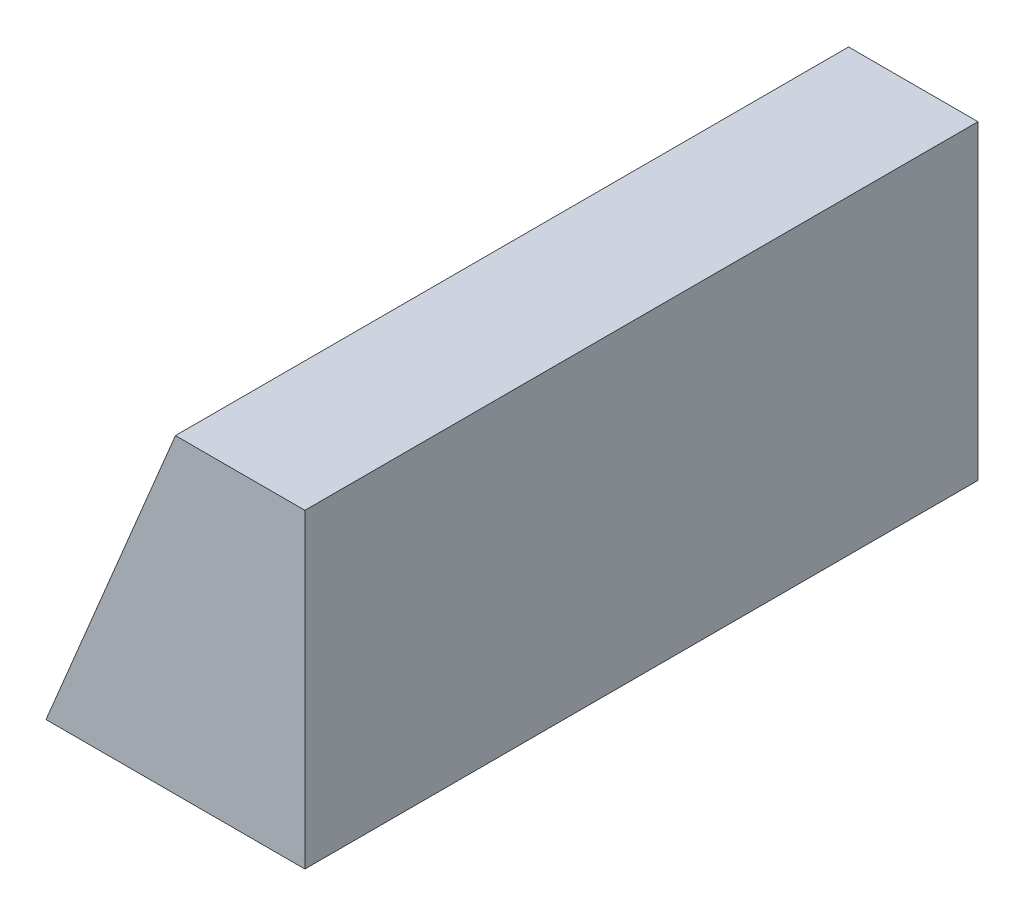
ISO-10303-21;
HEADER;
FILE_DESCRIPTION(('STEP AP214'),'2;1');
FILE_NAME('part.step','',(''),(''),'','','');
FILE_SCHEMA(('AUTOMOTIVE_DESIGN { 1 0 10303 214 1 1 1 1 }'));
ENDSEC;
DATA;
#1=APPLICATION_CONTEXT('core data for automotive mechanical design processes');
#2=APPLICATION_PROTOCOL_DEFINITION('international standard','automotive_design',2000,#1);
#3=PRODUCT_CONTEXT('',#1,'mechanical');
#4=PRODUCT('Part','Part','',(#3));
#5=PRODUCT_RELATED_PRODUCT_CATEGORY('part','',(#4));
#6=PRODUCT_DEFINITION_FORMATION('','',#4);
#7=PRODUCT_DEFINITION_CONTEXT('part definition',#1,'design');
#8=PRODUCT_DEFINITION('design','',#6,#7);
#9=PRODUCT_DEFINITION_SHAPE('','',#8);
#10=(LENGTH_UNIT() NAMED_UNIT(*) SI_UNIT(.MILLI.,.METRE.));
#11=(NAMED_UNIT(*) PLANE_ANGLE_UNIT() SI_UNIT($,.RADIAN.));
#12=(NAMED_UNIT(*) SI_UNIT($,.STERADIAN.) SOLID_ANGLE_UNIT());
#13=UNCERTAINTY_MEASURE_WITH_UNIT(LENGTH_MEASURE(1.E-05),#10,'distance_accuracy_value','');
#14=(GEOMETRIC_REPRESENTATION_CONTEXT(3) GLOBAL_UNCERTAINTY_ASSIGNED_CONTEXT((#13)) GLOBAL_UNIT_ASSIGNED_CONTEXT((#10,
#11,#12)) REPRESENTATION_CONTEXT('',''));
#15=CARTESIAN_POINT('',(0.,0.,0.));
#16=DIRECTION('',(0.,0.,1.));
#17=DIRECTION('',(1.,0.,0.));
#18=AXIS2_PLACEMENT_3D('',#15,#16,#17);
#19=CARTESIAN_POINT('',(-4.07101603678367,-1.92946058091286,26.));
#20=DIRECTION('',(0.923076923076923,-0.384615384615385,0.));
#21=DIRECTION('',(0.384615384615385,0.923076923076923,0.));
#22=AXIS2_PLACEMENT_3D('',#19,#20,#21);
#23=PLANE('',#22);
#24=DIRECTION('',(-0.384615384615385,-0.923076923076923,0.));
#25=VECTOR('',#24,1.);
#26=CARTESIAN_POINT('',(-4.07101603678367,-1.92946058091286,0.));
#27=LINE('',#26,#25);
#28=CARTESIAN_POINT('',(0.928983963216333,10.0705394190871,0.));
#29=VERTEX_POINT('',#28);
#30=CARTESIAN_POINT('',(-4.07101603678367,-1.92946058091286,0.));
#31=VERTEX_POINT('',#30);
#32=EDGE_CURVE('E97',#29,#31,#27,.T.);
#33=ORIENTED_EDGE('',*,*,#32,.T.);
#34=DIRECTION('',(0.,0.,-1.));
#35=VECTOR('',#34,1.);
#36=CARTESIAN_POINT('',(-4.07101603678367,-1.92946058091286,26.));
#37=LINE('',#36,#35);
#38=CARTESIAN_POINT('',(-4.07101603678367,-1.92946058091286,26.));
#39=VERTEX_POINT('',#38);
#40=EDGE_CURVE('E11',#39,#31,#37,.T.);
#41=ORIENTED_EDGE('',*,*,#40,.F.);
#42=DIRECTION('',(-0.384615384615385,-0.923076923076923,0.));
#43=VECTOR('',#42,1.);
#44=CARTESIAN_POINT('',(-4.07101603678367,-1.92946058091286,26.));
#45=LINE('',#44,#43);
#46=CARTESIAN_POINT('',(0.928983963216333,10.0705394190871,26.));
#47=VERTEX_POINT('',#46);
#48=EDGE_CURVE('E85',#47,#39,#45,.T.);
#49=ORIENTED_EDGE('',*,*,#48,.F.);
#50=DIRECTION('',(0.,0.,-1.));
#51=VECTOR('',#50,1.);
#52=CARTESIAN_POINT('',(0.928983963216333,10.0705394190871,26.));
#53=LINE('',#52,#51);
#54=EDGE_CURVE('E93',#47,#29,#53,.T.);
#55=ORIENTED_EDGE('',*,*,#54,.T.);
#56=EDGE_LOOP('',(#33,#41,#49,#55));
#57=FACE_BOUND('',#56,.T.);
#58=ADVANCED_FACE('F34',(#57),#23,.F.);
#59=CARTESIAN_POINT('',(-4.07101603678367,-1.92946058091286,26.));
#60=DIRECTION('',(0.,1.,0.));
#61=DIRECTION('',(0.,0.,1.));
#62=AXIS2_PLACEMENT_3D('',#59,#60,#61);
#63=PLANE('',#62);
#64=DIRECTION('',(1.,0.,0.));
#65=VECTOR('',#64,1.);
#66=CARTESIAN_POINT('',(-4.07101603678367,-1.92946058091286,0.));
#67=LINE('',#66,#65);
#68=CARTESIAN_POINT('',(5.92898396321633,-1.92946058091286,0.));
#69=VERTEX_POINT('',#68);
#70=EDGE_CURVE('E89',#31,#69,#67,.T.);
#71=ORIENTED_EDGE('',*,*,#70,.T.);
#72=DIRECTION('',(0.,0.,-1.));
#73=VECTOR('',#72,1.);
#74=CARTESIAN_POINT('',(5.92898396321633,-1.92946058091286,26.));
#75=LINE('',#74,#73);
#76=CARTESIAN_POINT('',(5.92898396321633,-1.92946058091286,26.));
#77=VERTEX_POINT('',#76);
#78=EDGE_CURVE('E42',#77,#69,#75,.T.);
#79=ORIENTED_EDGE('',*,*,#78,.F.);
#80=DIRECTION('',(1.,0.,0.));
#81=VECTOR('',#80,1.);
#82=CARTESIAN_POINT('',(-4.07101603678367,-1.92946058091286,26.));
#83=LINE('',#82,#81);
#84=EDGE_CURVE('E80',#39,#77,#83,.T.);
#85=ORIENTED_EDGE('',*,*,#84,.F.);
#86=ORIENTED_EDGE('',*,*,#40,.T.);
#87=EDGE_LOOP('',(#71,#79,#85,#86));
#88=FACE_BOUND('',#87,.T.);
#89=ADVANCED_FACE('F88',(#88),#63,.F.);
#90=CARTESIAN_POINT('',(5.92898396321633,-1.92946058091286,26.));
#91=DIRECTION('',(-1.,0.,0.));
#92=DIRECTION('',(0.,0.,1.));
#93=AXIS2_PLACEMENT_3D('',#90,#91,#92);
#94=PLANE('',#93);
#95=DIRECTION('',(0.,1.,0.));
#96=VECTOR('',#95,1.);
#97=CARTESIAN_POINT('',(5.92898396321633,-1.92946058091286,0.));
#98=LINE('',#97,#96);
#99=CARTESIAN_POINT('',(5.92898396321633,10.0705394190871,0.));
#100=VERTEX_POINT('',#99);
#101=EDGE_CURVE('E67',#69,#100,#98,.T.);
#102=ORIENTED_EDGE('',*,*,#101,.T.);
#103=DIRECTION('',(0.,0.,-1.));
#104=VECTOR('',#103,1.);
#105=CARTESIAN_POINT('',(5.92898396321633,10.0705394190871,26.));
#106=LINE('',#105,#104);
#107=CARTESIAN_POINT('',(5.92898396321633,10.0705394190871,26.));
#108=VERTEX_POINT('',#107);
#109=EDGE_CURVE('E90',#108,#100,#106,.T.);
#110=ORIENTED_EDGE('',*,*,#109,.F.);
#111=DIRECTION('',(0.,1.,0.));
#112=VECTOR('',#111,1.);
#113=CARTESIAN_POINT('',(5.92898396321633,-1.92946058091286,26.));
#114=LINE('',#113,#112);
#115=EDGE_CURVE('E83',#77,#108,#114,.T.);
#116=ORIENTED_EDGE('',*,*,#115,.F.);
#117=ORIENTED_EDGE('',*,*,#78,.T.);
#118=EDGE_LOOP('',(#102,#110,#116,#117));
#119=FACE_BOUND('',#118,.T.);
#120=ADVANCED_FACE('F91',(#119),#94,.F.);
#121=CARTESIAN_POINT('',(5.92898396321633,10.0705394190871,26.));
#122=DIRECTION('',(0.,-1.,0.));
#123=DIRECTION('',(0.,0.,-1.));
#124=AXIS2_PLACEMENT_3D('',#121,#122,#123);
#125=PLANE('',#124);
#126=DIRECTION('',(-1.,0.,0.));
#127=VECTOR('',#126,1.);
#128=CARTESIAN_POINT('',(5.92898396321633,10.0705394190871,0.));
#129=LINE('',#128,#127);
#130=EDGE_CURVE('E73',#100,#29,#129,.T.);
#131=ORIENTED_EDGE('',*,*,#130,.T.);
#132=ORIENTED_EDGE('',*,*,#54,.F.);
#133=DIRECTION('',(-1.,0.,0.));
#134=VECTOR('',#133,1.);
#135=CARTESIAN_POINT('',(5.92898396321633,10.0705394190871,26.));
#136=LINE('',#135,#134);
#137=EDGE_CURVE('E50',#108,#47,#136,.T.);
#138=ORIENTED_EDGE('',*,*,#137,.F.);
#139=ORIENTED_EDGE('',*,*,#109,.T.);
#140=EDGE_LOOP('',(#131,#132,#138,#139));
#141=FACE_BOUND('',#140,.T.);
#142=ADVANCED_FACE('F104',(#141),#125,.F.);
#143=CARTESIAN_POINT('',(0.,0.,26.));
#144=DIRECTION('',(0.,0.,1.));
#145=DIRECTION('',(1.,0.,0.));
#146=AXIS2_PLACEMENT_3D('',#143,#144,#145);
#147=PLANE('',#146);
#148=ORIENTED_EDGE('',*,*,#48,.T.);
#149=ORIENTED_EDGE('',*,*,#84,.T.);
#150=ORIENTED_EDGE('',*,*,#115,.T.);
#151=ORIENTED_EDGE('',*,*,#137,.T.);
#152=EDGE_LOOP('',(#148,#149,#150,#151));
#153=FACE_BOUND('',#152,.T.);
#154=ADVANCED_FACE('F81',(#153),#147,.T.);
#155=CARTESIAN_POINT('',(0.,0.,0.));
#156=DIRECTION('',(0.,0.,1.));
#157=DIRECTION('',(1.,0.,0.));
#158=AXIS2_PLACEMENT_3D('',#155,#156,#157);
#159=PLANE('',#158);
#160=ORIENTED_EDGE('',*,*,#32,.F.);
#161=ORIENTED_EDGE('',*,*,#130,.F.);
#162=ORIENTED_EDGE('',*,*,#101,.F.);
#163=ORIENTED_EDGE('',*,*,#70,.F.);
#164=EDGE_LOOP('',(#160,#161,#162,#163));
#165=FACE_BOUND('',#164,.T.);
#166=ADVANCED_FACE('F107',(#165),#159,.F.);
#167=CLOSED_SHELL('',(#58,#89,#120,#142,#154,#166));
#168=MANIFOLD_SOLID_BREP('B2',#167);
#169=ADVANCED_BREP_SHAPE_REPRESENTATION('',(#18,#168),#14);
#170=SHAPE_DEFINITION_REPRESENTATION(#9,#169);
ENDSEC;
END-ISO-10303-21;
